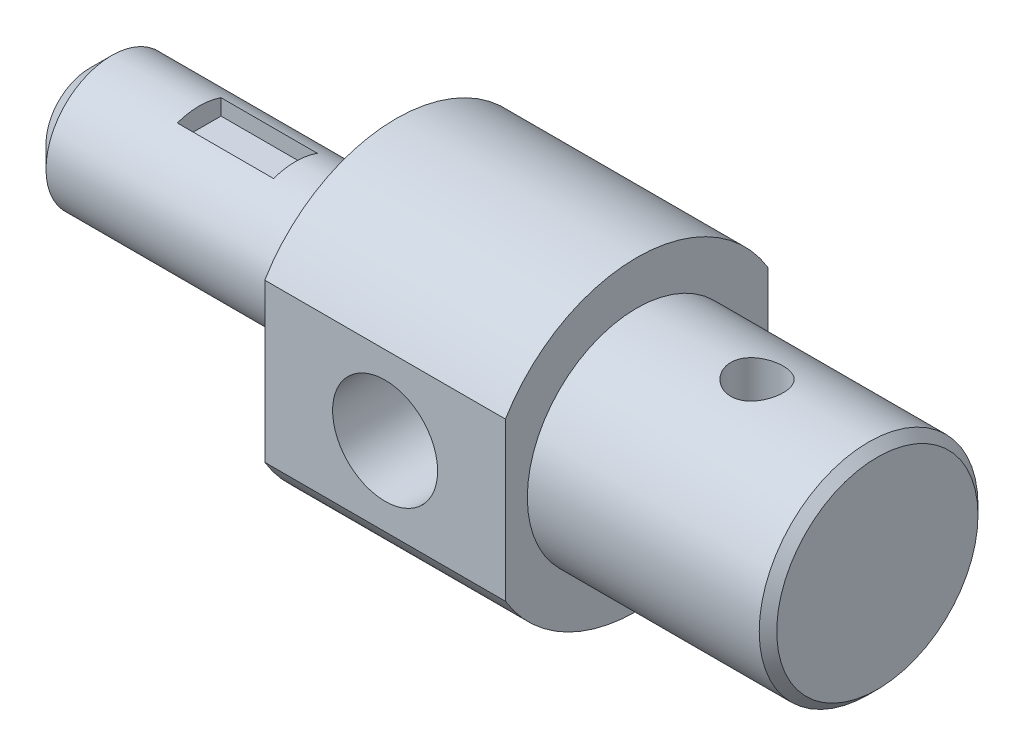
ISO-10303-21;
HEADER;
FILE_DESCRIPTION(('STEP AP214'),'2;1');
FILE_NAME('part.step','',(''),(''),'','','');
FILE_SCHEMA(('AUTOMOTIVE_DESIGN { 1 0 10303 214 1 1 1 1 }'));
ENDSEC;
DATA;
#1=APPLICATION_CONTEXT('core data for automotive mechanical design processes');
#2=APPLICATION_PROTOCOL_DEFINITION('international standard','automotive_design',2000,#1);
#3=PRODUCT_CONTEXT('',#1,'mechanical');
#4=PRODUCT('Part','Part','',(#3));
#5=PRODUCT_RELATED_PRODUCT_CATEGORY('part','',(#4));
#6=PRODUCT_DEFINITION_FORMATION('','',#4);
#7=PRODUCT_DEFINITION_CONTEXT('part definition',#1,'design');
#8=PRODUCT_DEFINITION('design','',#6,#7);
#9=PRODUCT_DEFINITION_SHAPE('','',#8);
#10=(LENGTH_UNIT() NAMED_UNIT(*) SI_UNIT(.MILLI.,.METRE.));
#11=(NAMED_UNIT(*) PLANE_ANGLE_UNIT() SI_UNIT($,.RADIAN.));
#12=(NAMED_UNIT(*) SI_UNIT($,.STERADIAN.) SOLID_ANGLE_UNIT());
#13=UNCERTAINTY_MEASURE_WITH_UNIT(LENGTH_MEASURE(1.E-05),#10,'distance_accuracy_value','');
#14=(GEOMETRIC_REPRESENTATION_CONTEXT(3) GLOBAL_UNCERTAINTY_ASSIGNED_CONTEXT((#13)) GLOBAL_UNIT_ASSIGNED_CONTEXT((#10,
#11,#12)) REPRESENTATION_CONTEXT('',''));
#15=CARTESIAN_POINT('',(0.,0.,0.));
#16=DIRECTION('',(0.,0.,1.));
#17=DIRECTION('',(1.,0.,0.));
#18=AXIS2_PLACEMENT_3D('',#15,#16,#17);
#19=CARTESIAN_POINT('',(70.,15.,0.));
#20=DIRECTION('',(-1.,0.,0.));
#21=DIRECTION('',(0.,0.,1.));
#22=AXIS2_PLACEMENT_3D('',#19,#20,#21);
#23=PLANE('',#22);
#24=CARTESIAN_POINT('',(70.,0.,0.));
#25=DIRECTION('',(1.,0.,0.));
#26=DIRECTION('',(0.,0.,-1.));
#27=AXIS2_PLACEMENT_3D('',#24,#25,#26);
#28=CIRCLE('',#27,15.);
#29=CARTESIAN_POINT('',(70.,0.,-15.));
#30=VERTEX_POINT('',#29);
#31=EDGE_CURVE('E156',#30,#30,#28,.T.);
#32=ORIENTED_EDGE('',*,*,#31,.T.);
#33=EDGE_LOOP('',(#32));
#34=FACE_BOUND('',#33,.T.);
#35=CARTESIAN_POINT('',(70.,0.,0.));
#36=DIRECTION('',(1.,0.,0.));
#37=DIRECTION('',(0.,0.,-1.));
#38=AXIS2_PLACEMENT_3D('',#35,#36,#37);
#39=CIRCLE('',#38,35.);
#40=CARTESIAN_POINT('',(70.,18.02775637732,-30.));
#41=VERTEX_POINT('',#40);
#42=CARTESIAN_POINT('',(70.,18.02775637732,30.));
#43=VERTEX_POINT('',#42);
#44=EDGE_CURVE('E152',#41,#43,#39,.T.);
#45=ORIENTED_EDGE('',*,*,#44,.F.);
#46=DIRECTION('',(0.,-1.,0.));
#47=VECTOR('',#46,1.);
#48=CARTESIAN_POINT('',(70.,15.,-30.));
#49=LINE('',#48,#47);
#50=CARTESIAN_POINT('',(70.,-18.02775637732,-30.));
#51=VERTEX_POINT('',#50);
#52=EDGE_CURVE('E133',#41,#51,#49,.T.);
#53=ORIENTED_EDGE('',*,*,#52,.T.);
#54=CARTESIAN_POINT('',(70.,-18.02775637732,30.));
#55=VERTEX_POINT('',#54);
#56=EDGE_CURVE('E153',#55,#51,#39,.T.);
#57=ORIENTED_EDGE('',*,*,#56,.F.);
#58=DIRECTION('',(0.,-1.,0.));
#59=VECTOR('',#58,1.);
#60=CARTESIAN_POINT('',(70.,15.,30.));
#61=LINE('',#60,#59);
#62=EDGE_CURVE('E140',#43,#55,#61,.T.);
#63=ORIENTED_EDGE('',*,*,#62,.F.);
#64=EDGE_LOOP('',(#45,#53,#57,#63));
#65=FACE_BOUND('',#64,.T.);
#66=ADVANCED_FACE('F33',(#34,#65),#23,.T.);
#67=CARTESIAN_POINT('',(0.,0.,0.));
#68=DIRECTION('',(1.,0.,0.));
#69=DIRECTION('',(0.,0.,-1.));
#70=AXIS2_PLACEMENT_3D('',#67,#68,#69);
#71=CYLINDRICAL_SURFACE('',#70,35.);
#72=CARTESIAN_POINT('',(125.,0.,0.));
#73=DIRECTION('',(1.,0.,0.));
#74=DIRECTION('',(0.,0.,-1.));
#75=AXIS2_PLACEMENT_3D('',#72,#73,#74);
#76=CIRCLE('',#75,35.);
#77=CARTESIAN_POINT('',(125.,18.02775637732,-30.));
#78=VERTEX_POINT('',#77);
#79=CARTESIAN_POINT('',(125.,18.02775637732,30.));
#80=VERTEX_POINT('',#79);
#81=EDGE_CURVE('E148',#78,#80,#76,.T.);
#82=ORIENTED_EDGE('',*,*,#81,.F.);
#83=DIRECTION('',(-1.,0.,0.));
#84=VECTOR('',#83,1.);
#85=CARTESIAN_POINT('',(535.971048403935,18.02775637732,-30.));
#86=LINE('',#85,#84);
#87=EDGE_CURVE('E56',#78,#41,#86,.T.);
#88=ORIENTED_EDGE('',*,*,#87,.T.);
#89=ORIENTED_EDGE('',*,*,#44,.T.);
#90=DIRECTION('',(-1.,0.,0.));
#91=VECTOR('',#90,1.);
#92=CARTESIAN_POINT('',(538.032982302177,18.02775637732,30.));
#93=LINE('',#92,#91);
#94=EDGE_CURVE('E137',#80,#43,#93,.T.);
#95=ORIENTED_EDGE('',*,*,#94,.F.);
#96=EDGE_LOOP('',(#82,#88,#89,#95));
#97=FACE_BOUND('',#96,.T.);
#98=ADVANCED_FACE('F230',(#97),#71,.T.);
#99=ORIENTED_EDGE('',*,*,#56,.T.);
#100=DIRECTION('',(-1.,0.,0.));
#101=VECTOR('',#100,1.);
#102=CARTESIAN_POINT('',(535.971048403935,-18.02775637732,-30.));
#103=LINE('',#102,#101);
#104=CARTESIAN_POINT('',(125.,-18.02775637732,-30.));
#105=VERTEX_POINT('',#104);
#106=EDGE_CURVE('E131',#105,#51,#103,.T.);
#107=ORIENTED_EDGE('',*,*,#106,.F.);
#108=CARTESIAN_POINT('',(125.,-18.02775637732,30.));
#109=VERTEX_POINT('',#108);
#110=EDGE_CURVE('E149',#109,#105,#76,.T.);
#111=ORIENTED_EDGE('',*,*,#110,.F.);
#112=DIRECTION('',(-1.,0.,0.));
#113=VECTOR('',#112,1.);
#114=CARTESIAN_POINT('',(538.032982302177,-18.02775637732,30.));
#115=LINE('',#114,#113);
#116=EDGE_CURVE('E138',#109,#55,#115,.T.);
#117=ORIENTED_EDGE('',*,*,#116,.T.);
#118=EDGE_LOOP('',(#99,#107,#111,#117));
#119=FACE_BOUND('',#118,.T.);
#120=ADVANCED_FACE('F236',(#119),#71,.T.);
#121=CARTESIAN_POINT('',(125.,35.,0.));
#122=DIRECTION('',(1.,0.,0.));
#123=DIRECTION('',(0.,0.,-1.));
#124=AXIS2_PLACEMENT_3D('',#121,#122,#123);
#125=PLANE('',#124);
#126=CARTESIAN_POINT('',(125.,0.,0.));
#127=DIRECTION('',(1.,0.,0.));
#128=DIRECTION('',(0.,0.,-1.));
#129=AXIS2_PLACEMENT_3D('',#126,#127,#128);
#130=CIRCLE('',#129,25.);
#131=CARTESIAN_POINT('',(125.,0.,-25.));
#132=VERTEX_POINT('',#131);
#133=EDGE_CURVE('E145',#132,#132,#130,.T.);
#134=ORIENTED_EDGE('',*,*,#133,.F.);
#135=EDGE_LOOP('',(#134));
#136=FACE_BOUND('',#135,.T.);
#137=ORIENTED_EDGE('',*,*,#110,.T.);
#138=DIRECTION('',(0.,1.,0.));
#139=VECTOR('',#138,1.);
#140=CARTESIAN_POINT('',(125.,35.,-30.));
#141=LINE('',#140,#139);
#142=EDGE_CURVE('E162',#105,#78,#141,.T.);
#143=ORIENTED_EDGE('',*,*,#142,.T.);
#144=ORIENTED_EDGE('',*,*,#81,.T.);
#145=DIRECTION('',(0.,1.,0.));
#146=VECTOR('',#145,1.);
#147=CARTESIAN_POINT('',(125.,35.,30.));
#148=LINE('',#147,#146);
#149=EDGE_CURVE('E159',#109,#80,#148,.T.);
#150=ORIENTED_EDGE('',*,*,#149,.F.);
#151=EDGE_LOOP('',(#137,#143,#144,#150));
#152=FACE_BOUND('',#151,.T.);
#153=ADVANCED_FACE('F246',(#136,#152),#125,.T.);
#154=CARTESIAN_POINT('',(0.,0.,0.));
#155=DIRECTION('',(-1.,0.,0.));
#156=DIRECTION('',(0.,0.,1.));
#157=AXIS2_PLACEMENT_3D('',#154,#155,#156);
#158=PLANE('',#157);
#159=CARTESIAN_POINT('',(0.,0.,0.));
#160=DIRECTION('',(-1.,0.,0.));
#161=DIRECTION('',(0.,0.,1.));
#162=AXIS2_PLACEMENT_3D('',#159,#160,#161);
#163=CIRCLE('',#162,9.99999999999998);
#164=CARTESIAN_POINT('',(0.,0.,9.99999999999998));
#165=VERTEX_POINT('',#164);
#166=EDGE_CURVE('E11',#165,#165,#163,.T.);
#167=ORIENTED_EDGE('',*,*,#166,.T.);
#168=EDGE_LOOP('',(#167));
#169=FACE_BOUND('',#168,.T.);
#170=ADVANCED_FACE('F243',(#169),#158,.T.);
#171=CARTESIAN_POINT('',(0.,0.,0.));
#172=DIRECTION('',(1.,0.,0.));
#173=DIRECTION('',(0.,0.,-1.));
#174=AXIS2_PLACEMENT_3D('',#171,#172,#173);
#175=CYLINDRICAL_SURFACE('',#174,15.);
#176=CARTESIAN_POINT('',(4.99999999999999,0.,0.));
#177=DIRECTION('',(-1.,0.,0.));
#178=DIRECTION('',(0.,0.,1.));
#179=AXIS2_PLACEMENT_3D('',#176,#177,#178);
#180=CIRCLE('',#179,15.);
#181=CARTESIAN_POINT('',(4.99999999999999,0.,15.));
#182=VERTEX_POINT('',#181);
#183=EDGE_CURVE('E41',#182,#182,#180,.F.);
#184=ORIENTED_EDGE('',*,*,#183,.T.);
#185=EDGE_LOOP('',(#184));
#186=FACE_BOUND('',#185,.T.);
#187=DIRECTION('',(1.,0.,0.));
#188=VECTOR('',#187,1.);
#189=CARTESIAN_POINT('',(0.,14.142135623731,-5.));
#190=LINE('',#189,#188);
#191=CARTESIAN_POINT('',(25.,14.142135623731,-5.));
#192=VERTEX_POINT('',#191);
#193=CARTESIAN_POINT('',(47.,14.142135623731,-5.));
#194=VERTEX_POINT('',#193);
#195=EDGE_CURVE('E106',#192,#194,#190,.T.);
#196=ORIENTED_EDGE('',*,*,#195,.T.);
#197=CARTESIAN_POINT('',(47.,0.,0.));
#198=DIRECTION('',(1.,0.,0.));
#199=DIRECTION('',(0.,0.,-1.));
#200=AXIS2_PLACEMENT_3D('',#197,#198,#199);
#201=CIRCLE('',#200,15.);
#202=CARTESIAN_POINT('',(47.,14.142135623731,5.));
#203=VERTEX_POINT('',#202);
#204=EDGE_CURVE('E166',#203,#194,#201,.F.);
#205=ORIENTED_EDGE('',*,*,#204,.F.);
#206=DIRECTION('',(1.,0.,0.));
#207=VECTOR('',#206,1.);
#208=CARTESIAN_POINT('',(0.,14.142135623731,5.));
#209=LINE('',#208,#207);
#210=CARTESIAN_POINT('',(25.,14.142135623731,5.));
#211=VERTEX_POINT('',#210);
#212=EDGE_CURVE('E164',#211,#203,#209,.T.);
#213=ORIENTED_EDGE('',*,*,#212,.F.);
#214=CARTESIAN_POINT('',(25.,0.,0.));
#215=DIRECTION('',(-1.,0.,0.));
#216=DIRECTION('',(0.,-1.,0.));
#217=AXIS2_PLACEMENT_3D('',#214,#215,#216);
#218=CIRCLE('',#217,15.);
#219=EDGE_CURVE('E168',#192,#211,#218,.F.);
#220=ORIENTED_EDGE('',*,*,#219,.F.);
#221=EDGE_LOOP('',(#196,#205,#213,#220));
#222=FACE_BOUND('',#221,.T.);
#223=ORIENTED_EDGE('',*,*,#31,.F.);
#224=EDGE_LOOP('',(#223));
#225=FACE_BOUND('',#224,.T.);
#226=ADVANCED_FACE('F226',(#186,#222,#225),#175,.T.);
#227=CARTESIAN_POINT('',(0.,0.,0.));
#228=DIRECTION('',(1.,0.,0.));
#229=DIRECTION('',(0.,0.,-1.));
#230=AXIS2_PLACEMENT_3D('',#227,#228,#229);
#231=CYLINDRICAL_SURFACE('',#230,25.);
#232=CARTESIAN_POINT('',(178.,0.,0.));
#233=DIRECTION('',(1.,0.,0.));
#234=DIRECTION('',(0.,0.,-1.));
#235=AXIS2_PLACEMENT_3D('',#232,#233,#234);
#236=CIRCLE('',#235,25.);
#237=CARTESIAN_POINT('',(178.,0.,-25.));
#238=VERTEX_POINT('',#237);
#239=EDGE_CURVE('E257',#238,#238,#236,.F.);
#240=ORIENTED_EDGE('',*,*,#239,.T.);
#241=EDGE_LOOP('',(#240));
#242=FACE_BOUND('',#241,.T.);
#243=CARTESIAN_POINT('',(152.5,-24.2693221990232,6.00000000000002));
#244=CARTESIAN_POINT('',(152.334059732421,-24.2693192173439,6.0000046005875));
#245=CARTESIAN_POINT('',(152.168170927862,-24.2710270328907,5.99311472313628));
#246=CARTESIAN_POINT('',(151.837554797768,-24.2777997433195,5.9656234486817));
#247=CARTESIAN_POINT('',(151.672827621959,-24.2828650632483,5.94502031563238));
#248=CARTESIAN_POINT('',(151.345720994805,-24.2962060432289,5.89025958920489));
#249=CARTESIAN_POINT('',(151.183342422632,-24.304482874777,5.85609704951732));
#250=CARTESIAN_POINT('',(150.862077676706,-24.324002012079,5.77448580831014));
#251=CARTESIAN_POINT('',(150.703192816905,-24.3352454135442,5.72703219729495));
#252=CARTESIAN_POINT('',(150.390334467303,-24.360345033975,5.619309547394));
#253=CARTESIAN_POINT('',(150.236353438213,-24.3741969907612,5.55906139358704));
#254=CARTESIAN_POINT('',(149.934011053083,-24.4041320001377,5.42613868912029));
#255=CARTESIAN_POINT('',(149.785651797663,-24.4202158764381,5.35345954837854));
#256=CARTESIAN_POINT('',(149.49563836158,-24.4541500249133,5.19624934621714));
#257=CARTESIAN_POINT('',(149.353981696174,-24.471999634801,5.11172272360157));
#258=CARTESIAN_POINT('',(149.078169448718,-24.5089827826596,4.931352573386));
#259=CARTESIAN_POINT('',(148.944016711315,-24.5281168015673,4.83550479634857));
#260=CARTESIAN_POINT('',(148.681787229777,-24.5674915774464,4.63134479435269));
#261=CARTESIAN_POINT('',(148.553862428646,-24.5877460219987,4.52284000132129));
#262=CARTESIAN_POINT('',(148.307515450407,-24.628482704143,4.29548353417838));
#263=CARTESIAN_POINT('',(148.189096817153,-24.6489650234755,4.17662803548194));
#264=CARTESIAN_POINT('',(147.962629314608,-24.6895792444555,3.92942214664514));
#265=CARTESIAN_POINT('',(147.854577587068,-24.7097112414296,3.80107439098764));
#266=CARTESIAN_POINT('',(147.649501235093,-24.749084932891,3.53564701496838));
#267=CARTESIAN_POINT('',(147.552480687483,-24.7683262966769,3.39856419538247));
#268=CARTESIAN_POINT('',(147.36905555161,-24.805612728147,3.11485061597086));
#269=CARTESIAN_POINT('',(147.282798277574,-24.8236399057151,2.96812218206264));
#270=CARTESIAN_POINT('',(147.122946590706,-24.8577272433076,2.66763492888514));
#271=CARTESIAN_POINT('',(147.049356957285,-24.8737866602544,2.51387348368351));
#272=CARTESIAN_POINT('',(146.915486733823,-24.9034639147108,2.20050084057474));
#273=CARTESIAN_POINT('',(146.855199803076,-24.917082914856,2.04089247207775));
#274=CARTESIAN_POINT('',(146.748364939181,-24.9415044760467,1.71693448898555));
#275=CARTESIAN_POINT('',(146.701821951162,-24.9523060231976,1.55258319115472));
#276=CARTESIAN_POINT('',(146.584991159946,-24.9796180760798,1.06042675145319));
#277=CARTESIAN_POINT('',(146.534824346529,-24.9916494382249,0.727223064781627));
#278=CARTESIAN_POINT('',(146.501859822332,-24.9995546719704,0.225051972672726));
#279=CARTESIAN_POINT('',(146.49792604613,-25.0004978214515,0.057200855693152));
#280=CARTESIAN_POINT('',(146.504110036623,-24.9990135577545,-0.278247999700334));
#281=CARTESIAN_POINT('',(146.514227977215,-24.9965861028638,-0.44584573495285));
#282=CARTESIAN_POINT('',(146.564925725473,-24.9844710986104,-0.939451198306518));
#283=CARTESIAN_POINT('',(146.625393719089,-24.9700581884779,-1.2635237636592));
#284=CARTESIAN_POINT('',(146.798183925197,-24.9299774285752,-1.89661000878183));
#285=CARTESIAN_POINT('',(146.910508771068,-24.9043090072343,-2.20562292291581));
#286=CARTESIAN_POINT('',(147.184773543608,-24.8441871252282,-2.80308340285015));
#287=CARTESIAN_POINT('',(147.347126478845,-24.8096609520016,-3.0913341639159));
#288=CARTESIAN_POINT('',(147.716526900029,-24.7355808399422,-3.63689114777197));
#289=CARTESIAN_POINT('',(147.923581610417,-24.6960260888452,-3.8941923581969));
#290=CARTESIAN_POINT('',(148.382630793077,-24.6150468786432,-4.37733250714648));
#291=CARTESIAN_POINT('',(148.635618729866,-24.5736003966327,-4.60222487048297));
#292=CARTESIAN_POINT('',(149.176151274788,-24.4944202534268,-5.0065913695287));
#293=CARTESIAN_POINT('',(149.4636972486,-24.4566867390692,-5.18606370943941));
#294=CARTESIAN_POINT('',(150.066930511737,-24.3891322466935,-5.49503965337252));
#295=CARTESIAN_POINT('',(150.382730101466,-24.3593449045093,-5.62433186444419));
#296=CARTESIAN_POINT('',(151.032466247427,-24.3114966451334,-5.82770650444351));
#297=CARTESIAN_POINT('',(151.366399250898,-24.2934334398264,-5.90179970658059));
#298=CARTESIAN_POINT('',(152.034186758633,-24.2715545321338,-5.99113700492854));
#299=CARTESIAN_POINT('',(152.367844139552,-24.2674017566251,-6.00777368474905));
#300=CARTESIAN_POINT('',(153.033166393619,-24.2728991225919,-5.98552405004057));
#301=CARTESIAN_POINT('',(153.36483143198,-24.2825481032417,-5.94664240499741));
#302=CARTESIAN_POINT('',(154.011691814451,-24.3142403018894,-5.81567711192228));
#303=CARTESIAN_POINT('',(154.327058277452,-24.3360979424442,-5.72438949541311));
#304=CARTESIAN_POINT('',(154.938015715724,-24.3895714349639,-5.49207803402933));
#305=CARTESIAN_POINT('',(155.233604488375,-24.421188371618,-5.35104866039819));
#306=CARTESIAN_POINT('',(155.802557221846,-24.491337816706,-5.0202958832683));
#307=CARTESIAN_POINT('',(156.075417684589,-24.5299859071541,-4.82973151657672));
#308=CARTESIAN_POINT('',(156.585802531372,-24.609553113729,-4.40637723136316));
#309=CARTESIAN_POINT('',(156.82332157398,-24.6504725718652,-4.17358094176828));
#310=CARTESIAN_POINT('',(157.261825956424,-24.7311017019711,-3.66607172916321));
#311=CARTESIAN_POINT('',(157.461852187838,-24.770762345906,-3.39052236174369));
#312=CARTESIAN_POINT('',(157.812832249533,-24.8434406642277,-2.80874047615625));
#313=CARTESIAN_POINT('',(157.9637885744,-24.8764586762761,-2.50250951879602));
#314=CARTESIAN_POINT('',(158.149364452397,-24.9181020803639,-2.02815096730082));
#315=CARTESIAN_POINT('',(158.204308244051,-24.9306431435962,-1.86803584664663));
#316=CARTESIAN_POINT('',(158.300515366414,-24.9528307363167,-1.54356696295538));
#317=CARTESIAN_POINT('',(158.341783825984,-24.9624783508485,-1.3792148139756));
#318=CARTESIAN_POINT('',(158.410290311299,-24.9785993962541,-1.04746058126015));
#319=CARTESIAN_POINT('',(158.437527628012,-24.9850726667189,-0.880058343837633));
#320=CARTESIAN_POINT('',(158.477740185572,-24.9946592960451,-0.543455945222823));
#321=CARTESIAN_POINT('',(158.49071603876,-24.997772799164,-0.374255861539245));
#322=CARTESIAN_POINT('',(158.502147010849,-25.0005148115007,-0.0395721662635904));
#323=CARTESIAN_POINT('',(158.500956570223,-25.0002283873103,0.125898766906489));
#324=CARTESIAN_POINT('',(158.484919900709,-24.9963838456846,0.456136647513671));
#325=CARTESIAN_POINT('',(158.470073968145,-24.9928257992435,0.620903610148969));
#326=CARTESIAN_POINT('',(158.426847259929,-24.9825354772041,0.948575696498042));
#327=CARTESIAN_POINT('',(158.398464447974,-24.9758027240481,1.11148053632314));
#328=CARTESIAN_POINT('',(158.328408810135,-24.9593507893913,1.43419100404801));
#329=CARTESIAN_POINT('',(158.286740696019,-24.9496326667266,1.59399770944889));
#330=CARTESIAN_POINT('',(158.190650753289,-24.9275215666658,1.90878490028137));
#331=CARTESIAN_POINT('',(158.136284317004,-24.9151402247435,2.06378312590841));
#332=CARTESIAN_POINT('',(158.015138852887,-24.8880146824749,2.36857079597773));
#333=CARTESIAN_POINT('',(157.948364162904,-24.8732713081285,2.51836203909184));
#334=CARTESIAN_POINT('',(157.802847567221,-24.841802398867,2.81187682420643));
#335=CARTESIAN_POINT('',(157.724100462436,-24.8250760035128,2.95559769529926));
#336=CARTESIAN_POINT('',(157.555243309792,-24.7900921246488,3.23593617076047));
#337=CARTESIAN_POINT('',(157.465137043432,-24.7718351513474,3.3725561177695));
#338=CARTESIAN_POINT('',(157.271977422558,-24.7338351675459,3.64090348698624));
#339=CARTESIAN_POINT('',(157.168676486658,-24.7140678232284,3.77244930795077));
#340=CARTESIAN_POINT('',(156.951544769352,-24.6739715765701,4.02636882328124));
#341=CARTESIAN_POINT('',(156.837717606122,-24.6536428688592,4.14874564331392));
#342=CARTESIAN_POINT('',(156.600184609401,-24.6129603609016,4.38365180469936));
#343=CARTESIAN_POINT('',(156.476472868406,-24.5926065529162,4.4961751716772));
#344=CARTESIAN_POINT('',(156.220085361673,-24.5524543239015,4.71050671781098));
#345=CARTESIAN_POINT('',(156.087412870277,-24.532655703704,4.81231877656936));
#346=CARTESIAN_POINT('',(155.811562626492,-24.4938254842292,5.00624248933447));
#347=CARTESIAN_POINT('',(155.668243136498,-24.474813007441,5.09815651544133));
#348=CARTESIAN_POINT('',(155.374205691691,-24.4384897622653,5.26952462166947));
#349=CARTESIAN_POINT('',(155.223490485579,-24.4211783687267,5.34898328559689));
#350=CARTESIAN_POINT('',(154.915717284004,-24.3887740639133,5.49484184745975));
#351=CARTESIAN_POINT('',(154.758662364921,-24.3736800927344,5.56124798952495));
#352=CARTESIAN_POINT('',(154.439315517869,-24.3461620490209,5.68050372849543));
#353=CARTESIAN_POINT('',(154.27702444086,-24.3337375451432,5.73335551583452));
#354=CARTESIAN_POINT('',(153.850944402755,-24.3054947105592,5.85223691155718));
#355=CARTESIAN_POINT('',(153.583926407974,-24.2920191452793,5.90755575023754));
#356=CARTESIAN_POINT('',(153.044559192327,-24.2739356520306,5.98143220718614));
#357=CARTESIAN_POINT('',(152.772210353942,-24.2693270902047,5.99999245314255));
#358=CARTESIAN_POINT('',(152.5,-24.2693221990232,6.00000000000002));
#359=B_SPLINE_CURVE_WITH_KNOTS('',3,(#243,#244,#245,#246,#247,#248,#249,#250,#251,#252,#253,
#254,#255,#256,#257,#258,#259,#260,#261,#262,#263,#264,#265,#266,#267,#268,#269,#270,#271,#272,
#273,#274,#275,#276,#277,#278,#279,#280,#281,#282,#283,#284,#285,#286,#287,#288,#289,#290,#291,
#292,#293,#294,#295,#296,#297,#298,#299,#300,#301,#302,#303,#304,#305,#306,#307,#308,#309,#310,
#311,#312,#313,#314,#315,#316,#317,#318,#319,#320,#321,#322,#323,#324,#325,#326,#327,#328,#329,
#330,#331,#332,#333,#334,#335,#336,#337,#338,#339,#340,#341,#342,#343,#344,#345,#346,#347,#348,
#349,#350,#351,#352,#353,#354,#355,#356,#357,#358),.UNSPECIFIED.,.T.,.F.,(4,2,2,2,2,2,2,2,2,2,2,
2,2,2,2,2,2,2,2,2,2,2,2,2,2,2,2,2,2,2,2,2,2,2,2,2,2,2,2,2,2,2,2,2,2,2,2,2,2,2,2,2,2,2,2,2,2,4),
(0.,0.49758059138039,0.995224186553697,1.49304948324963,1.9910589112069,2.48826158123246,
2.98564823885734,3.48284904015125,3.98023706425768,4.48653742340701,4.99302566076189,
5.49937385101411,6.00590856964273,6.51875380835027,7.03179211782626,7.54458535785563,
8.05756287894234,9.06317072582743,9.56637068685645,10.0695768752429,11.0544731736286,
12.0394194922331,13.0327253814724,14.0261919233719,15.0444773123883,16.0628029556732,
17.0853730875997,18.1077435918426,19.1051538629732,20.1024802497501,21.0850439079104,
22.0677168116699,23.068306995227,24.0690482527068,25.0926627677996,26.1162252368616,
26.6249401387151,27.1334640332022,27.6420136222756,28.1505413750131,28.6463730888496,
29.1421940434049,29.6380896060202,30.1338094895389,30.6274060608768,31.1208303973834,
31.6144696213306,32.1079449431357,32.6126284711584,33.1171391648263,33.6219536669565,
34.1265846927703,34.6399206216222,35.1530671874623,35.6659676710413,36.1787852157026,
36.9950805869968,37.8113176033062),.UNSPECIFIED.);
#360=CARTESIAN_POINT('',(152.5,-24.2693221990232,6.00000000000002));
#361=VERTEX_POINT('',#360);
#362=EDGE_CURVE('E180',#361,#361,#359,.T.);
#363=ORIENTED_EDGE('',*,*,#362,.F.);
#364=EDGE_LOOP('',(#363));
#365=FACE_BOUND('',#364,.T.);
#366=CARTESIAN_POINT('',(152.5,24.2693221990232,6.00000000000002));
#367=CARTESIAN_POINT('',(152.665940267579,24.2693192173439,6.0000046005875));
#368=CARTESIAN_POINT('',(152.831829072138,24.2710270328907,5.99311472313628));
#369=CARTESIAN_POINT('',(153.162445202232,24.2777997433195,5.9656234486817));
#370=CARTESIAN_POINT('',(153.327172378041,24.2828650632483,5.94502031563238));
#371=CARTESIAN_POINT('',(153.654279005195,24.2962060432289,5.89025958920489));
#372=CARTESIAN_POINT('',(153.816657577368,24.304482874777,5.85609704951732));
#373=CARTESIAN_POINT('',(154.137922323294,24.324002012079,5.77448580831014));
#374=CARTESIAN_POINT('',(154.296807183095,24.3352454135442,5.72703219729495));
#375=CARTESIAN_POINT('',(154.609665532697,24.360345033975,5.619309547394));
#376=CARTESIAN_POINT('',(154.763646561787,24.3741969907612,5.55906139358703));
#377=CARTESIAN_POINT('',(155.065988946917,24.4041320001377,5.42613868912028));
#378=CARTESIAN_POINT('',(155.214348202337,24.4202158764381,5.35345954837853));
#379=CARTESIAN_POINT('',(155.50436163842,24.4541500249133,5.19624934621714));
#380=CARTESIAN_POINT('',(155.646018303826,24.471999634801,5.11172272360157));
#381=CARTESIAN_POINT('',(155.921830551282,24.5089827826596,4.93135257338601));
#382=CARTESIAN_POINT('',(156.055983288685,24.5281168015673,4.83550479634857));
#383=CARTESIAN_POINT('',(156.318212770223,24.5674915774464,4.63134479435269));
#384=CARTESIAN_POINT('',(156.446137571354,24.5877460219987,4.52284000132129));
#385=CARTESIAN_POINT('',(156.692484549593,24.628482704143,4.29548353417838));
#386=CARTESIAN_POINT('',(156.810903182847,24.6489650234755,4.17662803548194));
#387=CARTESIAN_POINT('',(157.037370685392,24.6895792444555,3.92942214664514));
#388=CARTESIAN_POINT('',(157.145422412932,24.7097112414296,3.80107439098764));
#389=CARTESIAN_POINT('',(157.350498764907,24.749084932891,3.53564701496837));
#390=CARTESIAN_POINT('',(157.447519312517,24.7683262966769,3.39856419538247));
#391=CARTESIAN_POINT('',(157.63094444839,24.805612728147,3.11485061597086));
#392=CARTESIAN_POINT('',(157.717201722426,24.8236399057151,2.96812218206264));
#393=CARTESIAN_POINT('',(157.877053409294,24.8577272433076,2.66763492888514));
#394=CARTESIAN_POINT('',(157.950643042715,24.8737866602544,2.51387348368351));
#395=CARTESIAN_POINT('',(158.084513266177,24.9034639147108,2.20050084057473));
#396=CARTESIAN_POINT('',(158.144800196924,24.917082914856,2.04089247207774));
#397=CARTESIAN_POINT('',(158.251635060819,24.9415044760467,1.71693448898555));
#398=CARTESIAN_POINT('',(158.298178048838,24.9523060231976,1.55258319115471));
#399=CARTESIAN_POINT('',(158.415008840054,24.9796180760798,1.06042675145319));
#400=CARTESIAN_POINT('',(158.465175653471,24.9916494382249,0.727223064781627));
#401=CARTESIAN_POINT('',(158.498140177668,24.9995546719704,0.225051972672726));
#402=CARTESIAN_POINT('',(158.50207395387,25.0004978214515,0.0572008556931516));
#403=CARTESIAN_POINT('',(158.495889963377,24.9990135577545,-0.278247999700335));
#404=CARTESIAN_POINT('',(158.485772022785,24.9965861028638,-0.44584573495285));
#405=CARTESIAN_POINT('',(158.435074274527,24.9844710986104,-0.939451198306516));
#406=CARTESIAN_POINT('',(158.374606280911,24.9700581884779,-1.2635237636592));
#407=CARTESIAN_POINT('',(158.201816074803,24.9299774285752,-1.89661000878182));
#408=CARTESIAN_POINT('',(158.089491228932,24.9043090072343,-2.20562292291581));
#409=CARTESIAN_POINT('',(157.815226456392,24.8441871252282,-2.80308340285015));
#410=CARTESIAN_POINT('',(157.652873521155,24.8096609520016,-3.0913341639159));
#411=CARTESIAN_POINT('',(157.283473099971,24.7355808399422,-3.63689114777197));
#412=CARTESIAN_POINT('',(157.076418389583,24.6960260888452,-3.8941923581969));
#413=CARTESIAN_POINT('',(156.617369206923,24.6150468786432,-4.37733250714648));
#414=CARTESIAN_POINT('',(156.364381270134,24.5736003966327,-4.60222487048297));
#415=CARTESIAN_POINT('',(155.823848725212,24.4944202534268,-5.0065913695287));
#416=CARTESIAN_POINT('',(155.5363027514,24.4566867390692,-5.18606370943941));
#417=CARTESIAN_POINT('',(154.933069488263,24.3891322466935,-5.49503965337252));
#418=CARTESIAN_POINT('',(154.617269898534,24.3593449045093,-5.62433186444419));
#419=CARTESIAN_POINT('',(153.967533752573,24.3114966451334,-5.82770650444351));
#420=CARTESIAN_POINT('',(153.633600749102,24.2934334398264,-5.90179970658059));
#421=CARTESIAN_POINT('',(152.965813241367,24.2715545321338,-5.99113700492854));
#422=CARTESIAN_POINT('',(152.632155860448,24.2674017566251,-6.00777368474905));
#423=CARTESIAN_POINT('',(151.966833606381,24.2728991225919,-5.98552405004057));
#424=CARTESIAN_POINT('',(151.63516856802,24.2825481032417,-5.94664240499741));
#425=CARTESIAN_POINT('',(150.988308185549,24.3142403018894,-5.81567711192228));
#426=CARTESIAN_POINT('',(150.672941722548,24.3360979424442,-5.72438949541311));
#427=CARTESIAN_POINT('',(150.061984284276,24.3895714349639,-5.49207803402933));
#428=CARTESIAN_POINT('',(149.766395511625,24.421188371618,-5.35104866039818));
#429=CARTESIAN_POINT('',(149.197442778154,24.491337816706,-5.0202958832683));
#430=CARTESIAN_POINT('',(148.924582315411,24.5299859071541,-4.82973151657672));
#431=CARTESIAN_POINT('',(148.414197468628,24.609553113729,-4.40637723136316));
#432=CARTESIAN_POINT('',(148.17667842602,24.6504725718652,-4.17358094176828));
#433=CARTESIAN_POINT('',(147.738174043576,24.7311017019711,-3.66607172916321));
#434=CARTESIAN_POINT('',(147.538147812162,24.770762345906,-3.39052236174369));
#435=CARTESIAN_POINT('',(147.187167750467,24.8434406642277,-2.80874047615625));
#436=CARTESIAN_POINT('',(147.0362114256,24.8764586762761,-2.50250951879602));
#437=CARTESIAN_POINT('',(146.850635547603,24.9181020803639,-2.02815096730082));
#438=CARTESIAN_POINT('',(146.795691755949,24.9306431435962,-1.86803584664663));
#439=CARTESIAN_POINT('',(146.699484633586,24.9528307363167,-1.54356696295538));
#440=CARTESIAN_POINT('',(146.658216174016,24.9624783508485,-1.3792148139756));
#441=CARTESIAN_POINT('',(146.589709688701,24.9785993962541,-1.04746058126015));
#442=CARTESIAN_POINT('',(146.562472371988,24.9850726667189,-0.880058343837633));
#443=CARTESIAN_POINT('',(146.522259814428,24.9946592960451,-0.543455945222823));
#444=CARTESIAN_POINT('',(146.50928396124,24.997772799164,-0.374255861539245));
#445=CARTESIAN_POINT('',(146.497852989151,25.0005148115007,-0.0395721662635904));
#446=CARTESIAN_POINT('',(146.499043429777,25.0002283873103,0.125898766906489));
#447=CARTESIAN_POINT('',(146.515080099291,24.9963838456846,0.456136647513671));
#448=CARTESIAN_POINT('',(146.529926031855,24.9928257992435,0.620903610148969));
#449=CARTESIAN_POINT('',(146.573152740071,24.9825354772041,0.948575696498042));
#450=CARTESIAN_POINT('',(146.601535552026,24.9758027240481,1.11148053632314));
#451=CARTESIAN_POINT('',(146.671591189865,24.9593507893913,1.43419100404801));
#452=CARTESIAN_POINT('',(146.713259303981,24.9496326667266,1.59399770944889));
#453=CARTESIAN_POINT('',(146.809349246711,24.9275215666658,1.90878490028137));
#454=CARTESIAN_POINT('',(146.863715682996,24.9151402247435,2.0637831259084));
#455=CARTESIAN_POINT('',(146.984861147113,24.8880146824749,2.36857079597772));
#456=CARTESIAN_POINT('',(147.051635837096,24.8732713081285,2.51836203909184));
#457=CARTESIAN_POINT('',(147.197152432779,24.841802398867,2.81187682420643));
#458=CARTESIAN_POINT('',(147.275899537564,24.8250760035128,2.95559769529926));
#459=CARTESIAN_POINT('',(147.444756690208,24.7900921246488,3.23593617076047));
#460=CARTESIAN_POINT('',(147.534862956568,24.7718351513474,3.3725561177695));
#461=CARTESIAN_POINT('',(147.728022577442,24.7338351675459,3.64090348698624));
#462=CARTESIAN_POINT('',(147.831323513342,24.7140678232284,3.77244930795078));
#463=CARTESIAN_POINT('',(148.048455230648,24.6739715765701,4.02636882328126));
#464=CARTESIAN_POINT('',(148.162282393878,24.6536428688592,4.14874564331392));
#465=CARTESIAN_POINT('',(148.399815390599,24.6129603609016,4.38365180469936));
#466=CARTESIAN_POINT('',(148.523527131594,24.5926065529162,4.4961751716772));
#467=CARTESIAN_POINT('',(148.779914638327,24.5524543239015,4.71050671781098));
#468=CARTESIAN_POINT('',(148.912587129723,24.532655703704,4.81231877656936));
#469=CARTESIAN_POINT('',(149.188437373508,24.4938254842292,5.00624248933447));
#470=CARTESIAN_POINT('',(149.331756863502,24.474813007441,5.09815651544131));
#471=CARTESIAN_POINT('',(149.625794308309,24.4384897622653,5.26952462166946));
#472=CARTESIAN_POINT('',(149.776509514421,24.4211783687267,5.34898328559688));
#473=CARTESIAN_POINT('',(150.084282715996,24.3887740639133,5.49484184745975));
#474=CARTESIAN_POINT('',(150.241337635079,24.3736800927344,5.56124798952495));
#475=CARTESIAN_POINT('',(150.560684482131,24.3461620490209,5.68050372849543));
#476=CARTESIAN_POINT('',(150.72297555914,24.3337375451432,5.73335551583452));
#477=CARTESIAN_POINT('',(151.149055597245,24.3054947105592,5.85223691155718));
#478=CARTESIAN_POINT('',(151.416073592026,24.2920191452793,5.90755575023754));
#479=CARTESIAN_POINT('',(151.955440807673,24.2739356520306,5.98143220718614));
#480=CARTESIAN_POINT('',(152.227789646058,24.2693270902047,5.99999245314255));
#481=CARTESIAN_POINT('',(152.5,24.2693221990232,6.00000000000002));
#482=B_SPLINE_CURVE_WITH_KNOTS('',3,(#366,#367,#368,#369,#370,#371,#372,#373,#374,#375,#376,
#377,#378,#379,#380,#381,#382,#383,#384,#385,#386,#387,#388,#389,#390,#391,#392,#393,#394,#395,
#396,#397,#398,#399,#400,#401,#402,#403,#404,#405,#406,#407,#408,#409,#410,#411,#412,#413,#414,
#415,#416,#417,#418,#419,#420,#421,#422,#423,#424,#425,#426,#427,#428,#429,#430,#431,#432,#433,
#434,#435,#436,#437,#438,#439,#440,#441,#442,#443,#444,#445,#446,#447,#448,#449,#450,#451,#452,
#453,#454,#455,#456,#457,#458,#459,#460,#461,#462,#463,#464,#465,#466,#467,#468,#469,#470,#471,
#472,#473,#474,#475,#476,#477,#478,#479,#480,#481),.UNSPECIFIED.,.T.,.F.,(4,2,2,2,2,2,2,2,2,2,2,
2,2,2,2,2,2,2,2,2,2,2,2,2,2,2,2,2,2,2,2,2,2,2,2,2,2,2,2,2,2,2,2,2,2,2,2,2,2,2,2,2,2,2,2,2,2,4),
(0.,0.49758059138039,0.995224186553697,1.49304948324963,1.9910589112069,2.48826158123249,
2.98564823885734,3.48284904015122,3.98023706425768,4.48653742340701,4.99302566076189,
5.49937385101411,6.00590856964273,6.51875380835027,7.03179211782626,7.54458535785563,
8.05756287894233,9.06317072582742,9.56637068685645,10.0695768752429,11.0544731736286,
12.0394194922331,13.0327253814724,14.0261919233719,15.0444773123883,16.0628029556732,
17.0853730875997,18.1077435918426,19.1051538629732,20.1024802497501,21.0850439079104,
22.0677168116699,23.068306995227,24.0690482527068,25.0926627677996,26.1162252368616,
26.6249401387151,27.1334640332022,27.6420136222756,28.1505413750131,28.6463730888496,
29.1421940434049,29.6380896060202,30.1338094895389,30.6274060608768,31.1208303973834,
31.6144696213306,32.1079449431357,32.6126284711584,33.1171391648263,33.6219536669566,
34.1265846927704,34.6399206216222,35.1530671874623,35.6659676710413,36.1787852157027,
36.9950805869969,37.8113176033062),.UNSPECIFIED.);
#483=CARTESIAN_POINT('',(152.5,24.2693221990232,6.00000000000002));
#484=VERTEX_POINT('',#483);
#485=EDGE_CURVE('E172',#484,#484,#482,.T.);
#486=ORIENTED_EDGE('',*,*,#485,.F.);
#487=EDGE_LOOP('',(#486));
#488=FACE_BOUND('',#487,.T.);
#489=ORIENTED_EDGE('',*,*,#133,.T.);
#490=EDGE_LOOP('',(#489));
#491=FACE_BOUND('',#490,.T.);
#492=ADVANCED_FACE('F185',(#242,#365,#488,#491),#231,.T.);
#493=CARTESIAN_POINT('',(180.,25.,0.));
#494=DIRECTION('',(1.,0.,0.));
#495=DIRECTION('',(0.,0.,-1.));
#496=AXIS2_PLACEMENT_3D('',#493,#494,#495);
#497=PLANE('',#496);
#498=CARTESIAN_POINT('',(180.,0.,0.));
#499=DIRECTION('',(1.,0.,0.));
#500=DIRECTION('',(0.,0.,-1.));
#501=AXIS2_PLACEMENT_3D('',#498,#499,#500);
#502=CIRCLE('',#501,23.);
#503=CARTESIAN_POINT('',(180.,0.,-23.));
#504=VERTEX_POINT('',#503);
#505=EDGE_CURVE('E171',#504,#504,#502,.T.);
#506=ORIENTED_EDGE('',*,*,#505,.T.);
#507=EDGE_LOOP('',(#506));
#508=FACE_BOUND('',#507,.T.);
#509=ADVANCED_FACE('F219',(#508),#497,.T.);
#510=CARTESIAN_POINT('',(538.032982302177,18.02775637732,30.));
#511=DIRECTION('',(0.,0.,-1.));
#512=DIRECTION('',(-1.,0.,0.));
#513=AXIS2_PLACEMENT_3D('',#510,#511,#512);
#514=PLANE('',#513);
#515=CARTESIAN_POINT('',(97.5,0.,30.));
#516=DIRECTION('',(0.,0.,1.));
#517=DIRECTION('',(1.,0.,0.));
#518=AXIS2_PLACEMENT_3D('',#515,#516,#517);
#519=CIRCLE('',#518,12.);
#520=CARTESIAN_POINT('',(109.5,0.,30.));
#521=VERTEX_POINT('',#520);
#522=EDGE_CURVE('E399',#521,#521,#519,.T.);
#523=ORIENTED_EDGE('',*,*,#522,.F.);
#524=EDGE_LOOP('',(#523));
#525=FACE_BOUND('',#524,.T.);
#526=ORIENTED_EDGE('',*,*,#94,.T.);
#527=ORIENTED_EDGE('',*,*,#62,.T.);
#528=ORIENTED_EDGE('',*,*,#116,.F.);
#529=ORIENTED_EDGE('',*,*,#149,.T.);
#530=EDGE_LOOP('',(#526,#527,#528,#529));
#531=FACE_BOUND('',#530,.T.);
#532=ADVANCED_FACE('F216',(#525,#531),#514,.F.);
#533=CARTESIAN_POINT('',(535.971048403935,18.02775637732,-30.));
#534=DIRECTION('',(0.,0.,-1.));
#535=DIRECTION('',(-1.,0.,0.));
#536=AXIS2_PLACEMENT_3D('',#533,#534,#535);
#537=PLANE('',#536);
#538=CARTESIAN_POINT('',(97.5,0.,-30.));
#539=DIRECTION('',(0.,0.,1.));
#540=DIRECTION('',(1.,0.,0.));
#541=AXIS2_PLACEMENT_3D('',#538,#539,#540);
#542=CIRCLE('',#541,12.);
#543=CARTESIAN_POINT('',(109.5,0.,-30.));
#544=VERTEX_POINT('',#543);
#545=EDGE_CURVE('E126',#544,#544,#542,.T.);
#546=ORIENTED_EDGE('',*,*,#545,.T.);
#547=EDGE_LOOP('',(#546));
#548=FACE_BOUND('',#547,.T.);
#549=ORIENTED_EDGE('',*,*,#52,.F.);
#550=ORIENTED_EDGE('',*,*,#87,.F.);
#551=ORIENTED_EDGE('',*,*,#142,.F.);
#552=ORIENTED_EDGE('',*,*,#106,.T.);
#553=EDGE_LOOP('',(#549,#550,#551,#552));
#554=FACE_BOUND('',#553,.T.);
#555=ADVANCED_FACE('F213',(#548,#554),#537,.T.);
#556=CARTESIAN_POINT('',(25.,15.,-5.));
#557=DIRECTION('',(-1.,0.,0.));
#558=DIRECTION('',(0.,-1.,0.));
#559=AXIS2_PLACEMENT_3D('',#556,#557,#558);
#560=PLANE('',#559);
#561=DIRECTION('',(0.,-1.,0.));
#562=VECTOR('',#561,1.);
#563=CARTESIAN_POINT('',(25.,15.,-5.));
#564=LINE('',#563,#562);
#565=CARTESIAN_POINT('',(25.,10.5,-5.));
#566=VERTEX_POINT('',#565);
#567=EDGE_CURVE('E99',#192,#566,#564,.T.);
#568=ORIENTED_EDGE('',*,*,#567,.F.);
#569=ORIENTED_EDGE('',*,*,#219,.T.);
#570=DIRECTION('',(0.,-1.,0.));
#571=VECTOR('',#570,1.);
#572=CARTESIAN_POINT('',(25.,15.,5.));
#573=LINE('',#572,#571);
#574=CARTESIAN_POINT('',(25.,10.5,5.));
#575=VERTEX_POINT('',#574);
#576=EDGE_CURVE('E48',#211,#575,#573,.T.);
#577=ORIENTED_EDGE('',*,*,#576,.T.);
#578=DIRECTION('',(0.,0.,1.));
#579=VECTOR('',#578,1.);
#580=CARTESIAN_POINT('',(25.,10.5,-5.));
#581=LINE('',#580,#579);
#582=EDGE_CURVE('E111',#566,#575,#581,.T.);
#583=ORIENTED_EDGE('',*,*,#582,.F.);
#584=EDGE_LOOP('',(#568,#569,#577,#583));
#585=FACE_BOUND('',#584,.T.);
#586=ADVANCED_FACE('F112',(#585),#560,.F.);
#587=CARTESIAN_POINT('',(47.,15.,-5.));
#588=DIRECTION('',(1.,0.,0.));
#589=DIRECTION('',(0.,0.,-1.));
#590=AXIS2_PLACEMENT_3D('',#587,#588,#589);
#591=PLANE('',#590);
#592=ORIENTED_EDGE('',*,*,#204,.T.);
#593=DIRECTION('',(0.,1.,0.));
#594=VECTOR('',#593,1.);
#595=CARTESIAN_POINT('',(47.,15.,-5.));
#596=LINE('',#595,#594);
#597=CARTESIAN_POINT('',(47.,10.5,-5.));
#598=VERTEX_POINT('',#597);
#599=EDGE_CURVE('E116',#598,#194,#596,.T.);
#600=ORIENTED_EDGE('',*,*,#599,.F.);
#601=DIRECTION('',(0.,0.,1.));
#602=VECTOR('',#601,1.);
#603=CARTESIAN_POINT('',(47.,10.5,-5.));
#604=LINE('',#603,#602);
#605=CARTESIAN_POINT('',(47.,10.5,5.));
#606=VERTEX_POINT('',#605);
#607=EDGE_CURVE('E115',#598,#606,#604,.T.);
#608=ORIENTED_EDGE('',*,*,#607,.T.);
#609=DIRECTION('',(0.,1.,0.));
#610=VECTOR('',#609,1.);
#611=CARTESIAN_POINT('',(47.,15.,5.));
#612=LINE('',#611,#610);
#613=EDGE_CURVE('E108',#606,#203,#612,.T.);
#614=ORIENTED_EDGE('',*,*,#613,.T.);
#615=EDGE_LOOP('',(#592,#600,#608,#614));
#616=FACE_BOUND('',#615,.T.);
#617=ADVANCED_FACE('F205',(#616),#591,.F.);
#618=CARTESIAN_POINT('',(25.,10.5,-5.));
#619=DIRECTION('',(0.,-1.,0.));
#620=DIRECTION('',(0.,0.,-1.));
#621=AXIS2_PLACEMENT_3D('',#618,#619,#620);
#622=PLANE('',#621);
#623=DIRECTION('',(1.,0.,0.));
#624=VECTOR('',#623,1.);
#625=CARTESIAN_POINT('',(25.,10.5,5.));
#626=LINE('',#625,#624);
#627=EDGE_CURVE('E125',#575,#606,#626,.T.);
#628=ORIENTED_EDGE('',*,*,#627,.T.);
#629=ORIENTED_EDGE('',*,*,#607,.F.);
#630=DIRECTION('',(1.,0.,0.));
#631=VECTOR('',#630,1.);
#632=CARTESIAN_POINT('',(25.,10.5,-5.));
#633=LINE('',#632,#631);
#634=EDGE_CURVE('E104',#566,#598,#633,.T.);
#635=ORIENTED_EDGE('',*,*,#634,.F.);
#636=ORIENTED_EDGE('',*,*,#582,.T.);
#637=EDGE_LOOP('',(#628,#629,#635,#636));
#638=FACE_BOUND('',#637,.T.);
#639=ADVANCED_FACE('F118',(#638),#622,.F.);
#640=CARTESIAN_POINT('',(0.,0.,-5.));
#641=DIRECTION('',(0.,0.,1.));
#642=DIRECTION('',(1.,0.,0.));
#643=AXIS2_PLACEMENT_3D('',#640,#641,#642);
#644=PLANE('',#643);
#645=ORIENTED_EDGE('',*,*,#567,.T.);
#646=ORIENTED_EDGE('',*,*,#634,.T.);
#647=ORIENTED_EDGE('',*,*,#599,.T.);
#648=ORIENTED_EDGE('',*,*,#195,.F.);
#649=EDGE_LOOP('',(#645,#646,#647,#648));
#650=FACE_BOUND('',#649,.T.);
#651=ADVANCED_FACE('F101',(#650),#644,.T.);
#652=CARTESIAN_POINT('',(0.,0.,5.));
#653=DIRECTION('',(0.,0.,1.));
#654=DIRECTION('',(1.,0.,0.));
#655=AXIS2_PLACEMENT_3D('',#652,#653,#654);
#656=PLANE('',#655);
#657=ORIENTED_EDGE('',*,*,#212,.T.);
#658=ORIENTED_EDGE('',*,*,#613,.F.);
#659=ORIENTED_EDGE('',*,*,#627,.F.);
#660=ORIENTED_EDGE('',*,*,#576,.F.);
#661=EDGE_LOOP('',(#657,#658,#659,#660));
#662=FACE_BOUND('',#661,.T.);
#663=ADVANCED_FACE('F199',(#662),#656,.F.);
#664=CARTESIAN_POINT('',(97.5,0.,30.));
#665=DIRECTION('',(0.,0.,1.));
#666=DIRECTION('',(1.,0.,0.));
#667=AXIS2_PLACEMENT_3D('',#664,#665,#666);
#668=CYLINDRICAL_SURFACE('',#667,12.);
#669=ORIENTED_EDGE('',*,*,#545,.F.);
#670=EDGE_LOOP('',(#669));
#671=FACE_BOUND('',#670,.T.);
#672=ORIENTED_EDGE('',*,*,#522,.T.);
#673=EDGE_LOOP('',(#672));
#674=FACE_BOUND('',#673,.T.);
#675=ADVANCED_FACE('F194',(#671,#674),#668,.F.);
#676=CARTESIAN_POINT('',(152.5,-35.,0.));
#677=DIRECTION('',(0.,1.,0.));
#678=DIRECTION('',(0.,0.,1.));
#679=AXIS2_PLACEMENT_3D('',#676,#677,#678);
#680=CYLINDRICAL_SURFACE('',#679,6.00000000000002);
#681=ORIENTED_EDGE('',*,*,#362,.T.);
#682=EDGE_LOOP('',(#681));
#683=FACE_BOUND('',#682,.T.);
#684=ORIENTED_EDGE('',*,*,#485,.T.);
#685=EDGE_LOOP('',(#684));
#686=FACE_BOUND('',#685,.T.);
#687=ADVANCED_FACE('F189',(#683,#686),#680,.F.);
#688=CARTESIAN_POINT('',(180.,0.,0.));
#689=DIRECTION('',(-1.,0.,0.));
#690=DIRECTION('',(0.,0.,1.));
#691=AXIS2_PLACEMENT_3D('',#688,#689,#690);
#692=CONICAL_SURFACE('',#691,23.,0.785398163397447);
#693=ORIENTED_EDGE('',*,*,#239,.F.);
#694=EDGE_LOOP('',(#693));
#695=FACE_BOUND('',#694,.T.);
#696=ORIENTED_EDGE('',*,*,#505,.F.);
#697=EDGE_LOOP('',(#696));
#698=FACE_BOUND('',#697,.T.);
#699=ADVANCED_FACE('F193',(#695,#698),#692,.T.);
#700=CARTESIAN_POINT('',(4.99999999999999,0.,0.));
#701=DIRECTION('',(1.,0.,0.));
#702=DIRECTION('',(0.,0.,-1.));
#703=AXIS2_PLACEMENT_3D('',#700,#701,#702);
#704=CONICAL_SURFACE('',#703,15.,0.785398163397451);
#705=ORIENTED_EDGE('',*,*,#166,.F.);
#706=EDGE_LOOP('',(#705));
#707=FACE_BOUND('',#706,.T.);
#708=ORIENTED_EDGE('',*,*,#183,.F.);
#709=EDGE_LOOP('',(#708));
#710=FACE_BOUND('',#709,.T.);
#711=ADVANCED_FACE('F35',(#707,#710),#704,.T.);
#712=CLOSED_SHELL('',(#66,#98,#120,#153,#170,#226,#492,#509,#532,#555,#586,#617,#639,#651,#663,
#675,#687,#699,#711));
#713=MANIFOLD_SOLID_BREP('B2',#712);
#714=ADVANCED_BREP_SHAPE_REPRESENTATION('',(#18,#713),#14);
#715=SHAPE_DEFINITION_REPRESENTATION(#9,#714);
ENDSEC;
END-ISO-10303-21;
